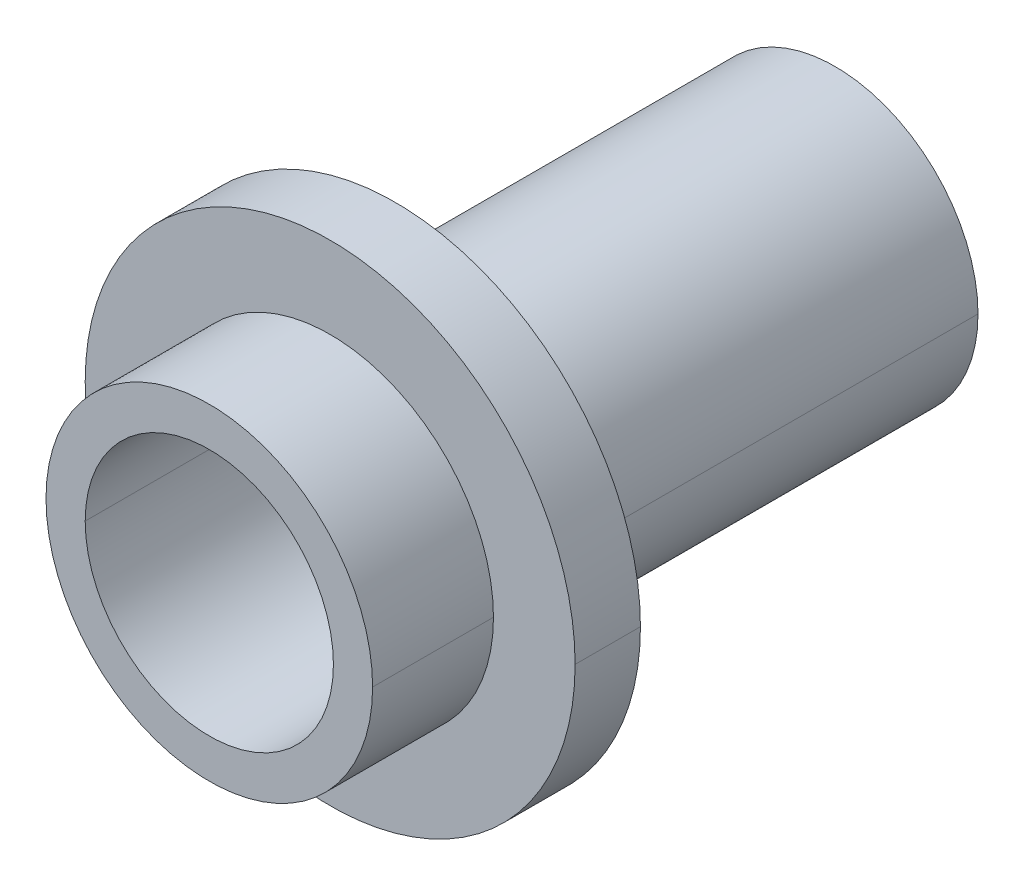
ISO-10303-21;
HEADER;
FILE_DESCRIPTION(('STEP AP214'),'2;1');
FILE_NAME('part.step','',(''),(''),'','','');
FILE_SCHEMA(('AUTOMOTIVE_DESIGN { 1 0 10303 214 1 1 1 1 }'));
ENDSEC;
DATA;
#1=APPLICATION_CONTEXT('core data for automotive mechanical design processes');
#2=APPLICATION_PROTOCOL_DEFINITION('international standard','automotive_design',2000,#1);
#3=PRODUCT_CONTEXT('',#1,'mechanical');
#4=PRODUCT('Part','Part','',(#3));
#5=PRODUCT_RELATED_PRODUCT_CATEGORY('part','',(#4));
#6=PRODUCT_DEFINITION_FORMATION('','',#4);
#7=PRODUCT_DEFINITION_CONTEXT('part definition',#1,'design');
#8=PRODUCT_DEFINITION('design','',#6,#7);
#9=PRODUCT_DEFINITION_SHAPE('','',#8);
#10=(LENGTH_UNIT() NAMED_UNIT(*) SI_UNIT(.MILLI.,.METRE.));
#11=(NAMED_UNIT(*) PLANE_ANGLE_UNIT() SI_UNIT($,.RADIAN.));
#12=(NAMED_UNIT(*) SI_UNIT($,.STERADIAN.) SOLID_ANGLE_UNIT());
#13=UNCERTAINTY_MEASURE_WITH_UNIT(LENGTH_MEASURE(1.E-05),#10,'distance_accuracy_value','');
#14=(GEOMETRIC_REPRESENTATION_CONTEXT(3) GLOBAL_UNCERTAINTY_ASSIGNED_CONTEXT((#13)) GLOBAL_UNIT_ASSIGNED_CONTEXT((#10,
#11,#12)) REPRESENTATION_CONTEXT('',''));
#15=CARTESIAN_POINT('',(0.,0.,0.));
#16=DIRECTION('',(0.,0.,1.));
#17=DIRECTION('',(1.,0.,0.));
#18=AXIS2_PLACEMENT_3D('',#15,#16,#17);
#19=CARTESIAN_POINT('',(0.,0.,-18.3642));
#20=DIRECTION('',(0.,0.,1.));
#21=DIRECTION('',(1.,0.,0.));
#22=AXIS2_PLACEMENT_3D('',#19,#20,#21);
#23=CYLINDRICAL_SURFACE('',#22,5.55625);
#24=DIRECTION('',(0.,0.,1.));
#25=VECTOR('',#24,1.);
#26=CARTESIAN_POINT('',(-5.55625,0.,-18.3642));
#27=LINE('',#26,#25);
#28=CARTESIAN_POINT('',(-5.55625,0.,-18.3642));
#29=VERTEX_POINT('',#28);
#30=CARTESIAN_POINT('',(-5.55625,0.,-1.27));
#31=VERTEX_POINT('',#30);
#32=EDGE_CURVE('E136',#29,#31,#27,.T.);
#33=ORIENTED_EDGE('',*,*,#32,.F.);
#34=CARTESIAN_POINT('',(0.,0.,-18.3642));
#35=DIRECTION('',(0.,0.,-1.));
#36=DIRECTION('',(-1.,0.,0.));
#37=AXIS2_PLACEMENT_3D('',#34,#35,#36);
#38=CIRCLE('',#37,5.55625);
#39=CARTESIAN_POINT('',(5.55625,0.,-18.3642));
#40=VERTEX_POINT('',#39);
#41=EDGE_CURVE('E11',#40,#29,#38,.T.);
#42=ORIENTED_EDGE('',*,*,#41,.F.);
#43=DIRECTION('',(0.,0.,1.));
#44=VECTOR('',#43,1.);
#45=CARTESIAN_POINT('',(5.55625,0.,-18.3642));
#46=LINE('',#45,#44);
#47=CARTESIAN_POINT('',(5.55625,0.,-1.27));
#48=VERTEX_POINT('',#47);
#49=EDGE_CURVE('E169',#40,#48,#46,.T.);
#50=ORIENTED_EDGE('',*,*,#49,.T.);
#51=CARTESIAN_POINT('',(0.,0.,-1.27));
#52=DIRECTION('',(0.,0.,-1.));
#53=DIRECTION('',(1.,0.,0.));
#54=AXIS2_PLACEMENT_3D('',#51,#52,#53);
#55=CIRCLE('',#54,5.55625);
#56=EDGE_CURVE('E111',#48,#31,#55,.T.);
#57=ORIENTED_EDGE('',*,*,#56,.T.);
#58=EDGE_LOOP('',(#33,#42,#50,#57));
#59=FACE_BOUND('',#58,.T.);
#60=ADVANCED_FACE('F16',(#59),#23,.T.);
#61=CARTESIAN_POINT('',(0.,0.,-18.3642));
#62=DIRECTION('',(0.,0.,-1.));
#63=DIRECTION('',(0.,-1.,0.));
#64=AXIS2_PLACEMENT_3D('',#61,#62,#63);
#65=PLANE('',#64);
#66=CARTESIAN_POINT('',(0.,0.,-18.3642));
#67=DIRECTION('',(0.,0.,-1.));
#68=DIRECTION('',(-1.,0.,0.));
#69=AXIS2_PLACEMENT_3D('',#66,#67,#68);
#70=CIRCLE('',#69,4.826);
#71=CARTESIAN_POINT('',(-4.826,0.,-18.3642));
#72=VERTEX_POINT('',#71);
#73=CARTESIAN_POINT('',(4.826,0.,-18.3642));
#74=VERTEX_POINT('',#73);
#75=EDGE_CURVE('E20',#72,#74,#70,.T.);
#76=ORIENTED_EDGE('',*,*,#75,.F.);
#77=CARTESIAN_POINT('',(0.,0.,-18.3642));
#78=DIRECTION('',(0.,0.,-1.));
#79=DIRECTION('',(-1.,0.,0.));
#80=AXIS2_PLACEMENT_3D('',#77,#78,#79);
#81=CIRCLE('',#80,4.826);
#82=EDGE_CURVE('E130',#74,#72,#81,.T.);
#83=ORIENTED_EDGE('',*,*,#82,.F.);
#84=EDGE_LOOP('',(#76,#83));
#85=FACE_BOUND('',#84,.T.);
#86=ORIENTED_EDGE('',*,*,#41,.T.);
#87=CARTESIAN_POINT('',(0.,0.,-18.3642));
#88=DIRECTION('',(0.,0.,-1.));
#89=DIRECTION('',(-1.,0.,0.));
#90=AXIS2_PLACEMENT_3D('',#87,#88,#89);
#91=CIRCLE('',#90,5.55625);
#92=EDGE_CURVE('E139',#29,#40,#91,.T.);
#93=ORIENTED_EDGE('',*,*,#92,.T.);
#94=EDGE_LOOP('',(#86,#93));
#95=FACE_BOUND('',#94,.T.);
#96=ADVANCED_FACE('F309',(#85,#95),#65,.T.);
#97=CARTESIAN_POINT('',(0.,0.,5.969));
#98=DIRECTION('',(0.,0.,-1.));
#99=DIRECTION('',(-1.,0.,0.));
#100=AXIS2_PLACEMENT_3D('',#97,#98,#99);
#101=CYLINDRICAL_SURFACE('',#100,6.35);
#102=DIRECTION('',(0.,0.,-1.));
#103=VECTOR('',#102,1.);
#104=CARTESIAN_POINT('',(6.35,0.,5.969));
#105=LINE('',#104,#103);
#106=CARTESIAN_POINT('',(6.35,0.,5.969));
#107=VERTEX_POINT('',#106);
#108=CARTESIAN_POINT('',(6.35,0.,1.27));
#109=VERTEX_POINT('',#108);
#110=EDGE_CURVE('E151',#107,#109,#105,.T.);
#111=ORIENTED_EDGE('',*,*,#110,.F.);
#112=CARTESIAN_POINT('',(0.,0.,5.969));
#113=DIRECTION('',(0.,0.,1.));
#114=DIRECTION('',(1.,0.,0.));
#115=AXIS2_PLACEMENT_3D('',#112,#113,#114);
#116=CIRCLE('',#115,6.35);
#117=CARTESIAN_POINT('',(-6.35,0.,5.969));
#118=VERTEX_POINT('',#117);
#119=EDGE_CURVE('E27',#118,#107,#116,.T.);
#120=ORIENTED_EDGE('',*,*,#119,.F.);
#121=DIRECTION('',(0.,0.,-1.));
#122=VECTOR('',#121,1.);
#123=CARTESIAN_POINT('',(-6.35,0.,5.969));
#124=LINE('',#123,#122);
#125=CARTESIAN_POINT('',(-6.35,0.,1.27));
#126=VERTEX_POINT('',#125);
#127=EDGE_CURVE('E150',#118,#126,#124,.T.);
#128=ORIENTED_EDGE('',*,*,#127,.T.);
#129=CARTESIAN_POINT('',(0.,0.,1.27));
#130=DIRECTION('',(0.,0.,1.));
#131=DIRECTION('',(1.,0.,0.));
#132=AXIS2_PLACEMENT_3D('',#129,#130,#131);
#133=CIRCLE('',#132,6.35);
#134=EDGE_CURVE('E110',#126,#109,#133,.T.);
#135=ORIENTED_EDGE('',*,*,#134,.T.);
#136=EDGE_LOOP('',(#111,#120,#128,#135));
#137=FACE_BOUND('',#136,.T.);
#138=ADVANCED_FACE('F305',(#137),#101,.T.);
#139=CARTESIAN_POINT('',(0.,0.,5.969));
#140=DIRECTION('',(0.,0.,1.));
#141=DIRECTION('',(1.,0.,0.));
#142=AXIS2_PLACEMENT_3D('',#139,#140,#141);
#143=PLANE('',#142);
#144=CARTESIAN_POINT('',(0.,0.,5.969));
#145=DIRECTION('',(0.,0.,1.));
#146=DIRECTION('',(1.,0.,0.));
#147=AXIS2_PLACEMENT_3D('',#144,#145,#146);
#148=CIRCLE('',#147,4.826);
#149=CARTESIAN_POINT('',(-4.826,0.,5.969));
#150=VERTEX_POINT('',#149);
#151=CARTESIAN_POINT('',(4.826,0.,5.969));
#152=VERTEX_POINT('',#151);
#153=EDGE_CURVE('E156',#150,#152,#148,.T.);
#154=ORIENTED_EDGE('',*,*,#153,.F.);
#155=CARTESIAN_POINT('',(0.,0.,5.969));
#156=DIRECTION('',(0.,0.,1.));
#157=DIRECTION('',(1.,0.,0.));
#158=AXIS2_PLACEMENT_3D('',#155,#156,#157);
#159=CIRCLE('',#158,4.826);
#160=EDGE_CURVE('E145',#152,#150,#159,.T.);
#161=ORIENTED_EDGE('',*,*,#160,.F.);
#162=EDGE_LOOP('',(#154,#161));
#163=FACE_BOUND('',#162,.T.);
#164=ORIENTED_EDGE('',*,*,#119,.T.);
#165=CARTESIAN_POINT('',(0.,0.,5.969));
#166=DIRECTION('',(0.,0.,1.));
#167=DIRECTION('',(1.,0.,0.));
#168=AXIS2_PLACEMENT_3D('',#165,#166,#167);
#169=CIRCLE('',#168,6.35);
#170=EDGE_CURVE('E134',#107,#118,#169,.T.);
#171=ORIENTED_EDGE('',*,*,#170,.T.);
#172=EDGE_LOOP('',(#164,#171));
#173=FACE_BOUND('',#172,.T.);
#174=ADVANCED_FACE('F281',(#163,#173),#143,.T.);
#175=CARTESIAN_POINT('',(0.,0.,1.27));
#176=DIRECTION('',(0.,0.,-1.));
#177=DIRECTION('',(-1.,0.,0.));
#178=AXIS2_PLACEMENT_3D('',#175,#176,#177);
#179=CYLINDRICAL_SURFACE('',#178,4.826);
#180=DIRECTION('',(0.,0.,-1.));
#181=VECTOR('',#180,1.);
#182=CARTESIAN_POINT('',(4.826,0.,1.27));
#183=LINE('',#182,#181);
#184=EDGE_CURVE('E152',#152,#74,#183,.T.);
#185=ORIENTED_EDGE('',*,*,#184,.F.);
#186=ORIENTED_EDGE('',*,*,#160,.T.);
#187=DIRECTION('',(0.,0.,-1.));
#188=VECTOR('',#187,1.);
#189=CARTESIAN_POINT('',(-4.826,0.,1.27));
#190=LINE('',#189,#188);
#191=EDGE_CURVE('E120',#150,#72,#190,.T.);
#192=ORIENTED_EDGE('',*,*,#191,.T.);
#193=ORIENTED_EDGE('',*,*,#75,.T.);
#194=EDGE_LOOP('',(#185,#186,#192,#193));
#195=FACE_BOUND('',#194,.T.);
#196=ADVANCED_FACE('F277',(#195),#179,.F.);
#197=CARTESIAN_POINT('',(0.,0.,1.27));
#198=DIRECTION('',(0.,0.,-1.));
#199=DIRECTION('',(-1.,0.,0.));
#200=AXIS2_PLACEMENT_3D('',#197,#198,#199);
#201=CYLINDRICAL_SURFACE('',#200,9.525);
#202=DIRECTION('',(0.,0.,-1.));
#203=VECTOR('',#202,1.);
#204=CARTESIAN_POINT('',(9.525,0.,1.27));
#205=LINE('',#204,#203);
#206=CARTESIAN_POINT('',(9.525,0.,1.27));
#207=VERTEX_POINT('',#206);
#208=CARTESIAN_POINT('',(9.525,0.,-1.27));
#209=VERTEX_POINT('',#208);
#210=EDGE_CURVE('E105',#207,#209,#205,.T.);
#211=ORIENTED_EDGE('',*,*,#210,.F.);
#212=CARTESIAN_POINT('',(0.,0.,1.27));
#213=DIRECTION('',(0.,0.,1.));
#214=DIRECTION('',(1.,0.,0.));
#215=AXIS2_PLACEMENT_3D('',#212,#213,#214);
#216=CIRCLE('',#215,9.525);
#217=CARTESIAN_POINT('',(-9.525,0.,1.27));
#218=VERTEX_POINT('',#217);
#219=EDGE_CURVE('E99',#218,#207,#216,.T.);
#220=ORIENTED_EDGE('',*,*,#219,.F.);
#221=DIRECTION('',(0.,0.,-1.));
#222=VECTOR('',#221,1.);
#223=CARTESIAN_POINT('',(-9.525,0.,1.27));
#224=LINE('',#223,#222);
#225=CARTESIAN_POINT('',(-9.525,0.,-1.27));
#226=VERTEX_POINT('',#225);
#227=EDGE_CURVE('E102',#218,#226,#224,.T.);
#228=ORIENTED_EDGE('',*,*,#227,.T.);
#229=CARTESIAN_POINT('',(0.,0.,-1.27));
#230=DIRECTION('',(0.,0.,1.));
#231=DIRECTION('',(1.,0.,0.));
#232=AXIS2_PLACEMENT_3D('',#229,#230,#231);
#233=CIRCLE('',#232,9.525);
#234=EDGE_CURVE('E40',#226,#209,#233,.T.);
#235=ORIENTED_EDGE('',*,*,#234,.T.);
#236=EDGE_LOOP('',(#211,#220,#228,#235));
#237=FACE_BOUND('',#236,.T.);
#238=ADVANCED_FACE('F101',(#237),#201,.T.);
#239=CARTESIAN_POINT('',(0.,0.,1.27));
#240=DIRECTION('',(0.,0.,1.));
#241=DIRECTION('',(1.,0.,0.));
#242=AXIS2_PLACEMENT_3D('',#239,#240,#241);
#243=PLANE('',#242);
#244=ORIENTED_EDGE('',*,*,#134,.F.);
#245=CARTESIAN_POINT('',(0.,0.,1.27));
#246=DIRECTION('',(0.,0.,1.));
#247=DIRECTION('',(1.,0.,0.));
#248=AXIS2_PLACEMENT_3D('',#245,#246,#247);
#249=CIRCLE('',#248,6.35);
#250=EDGE_CURVE('E146',#109,#126,#249,.T.);
#251=ORIENTED_EDGE('',*,*,#250,.F.);
#252=EDGE_LOOP('',(#244,#251));
#253=FACE_BOUND('',#252,.T.);
#254=ORIENTED_EDGE('',*,*,#219,.T.);
#255=CARTESIAN_POINT('',(0.,0.,1.27));
#256=DIRECTION('',(0.,0.,1.));
#257=DIRECTION('',(1.,0.,0.));
#258=AXIS2_PLACEMENT_3D('',#255,#256,#257);
#259=CIRCLE('',#258,9.525);
#260=EDGE_CURVE('E115',#207,#218,#259,.T.);
#261=ORIENTED_EDGE('',*,*,#260,.T.);
#262=EDGE_LOOP('',(#254,#261));
#263=FACE_BOUND('',#262,.T.);
#264=ADVANCED_FACE('F18',(#253,#263),#243,.T.);
#265=CARTESIAN_POINT('',(0.,0.,-1.27));
#266=DIRECTION('',(0.,0.,1.));
#267=DIRECTION('',(1.,0.,0.));
#268=AXIS2_PLACEMENT_3D('',#265,#266,#267);
#269=PLANE('',#268);
#270=ORIENTED_EDGE('',*,*,#56,.F.);
#271=CARTESIAN_POINT('',(0.,0.,-1.27));
#272=DIRECTION('',(0.,0.,-1.));
#273=DIRECTION('',(1.,0.,0.));
#274=AXIS2_PLACEMENT_3D('',#271,#272,#273);
#275=CIRCLE('',#274,5.55625);
#276=EDGE_CURVE('E138',#31,#48,#275,.T.);
#277=ORIENTED_EDGE('',*,*,#276,.F.);
#278=EDGE_LOOP('',(#270,#277));
#279=FACE_BOUND('',#278,.T.);
#280=ORIENTED_EDGE('',*,*,#234,.F.);
#281=CARTESIAN_POINT('',(0.,0.,-1.27));
#282=DIRECTION('',(0.,0.,1.));
#283=DIRECTION('',(1.,0.,0.));
#284=AXIS2_PLACEMENT_3D('',#281,#282,#283);
#285=CIRCLE('',#284,9.525);
#286=EDGE_CURVE('E116',#209,#226,#285,.T.);
#287=ORIENTED_EDGE('',*,*,#286,.F.);
#288=EDGE_LOOP('',(#280,#287));
#289=FACE_BOUND('',#288,.T.);
#290=ADVANCED_FACE('F287',(#279,#289),#269,.F.);
#291=CARTESIAN_POINT('',(0.,0.,1.27));
#292=DIRECTION('',(0.,0.,-1.));
#293=DIRECTION('',(-1.,0.,0.));
#294=AXIS2_PLACEMENT_3D('',#291,#292,#293);
#295=CYLINDRICAL_SURFACE('',#294,9.525);
#296=ORIENTED_EDGE('',*,*,#260,.F.);
#297=ORIENTED_EDGE('',*,*,#210,.T.);
#298=ORIENTED_EDGE('',*,*,#286,.T.);
#299=ORIENTED_EDGE('',*,*,#227,.F.);
#300=EDGE_LOOP('',(#296,#297,#298,#299));
#301=FACE_BOUND('',#300,.T.);
#302=ADVANCED_FACE('F114',(#301),#295,.T.);
#303=CARTESIAN_POINT('',(0.,0.,1.27));
#304=DIRECTION('',(0.,0.,-1.));
#305=DIRECTION('',(-1.,0.,0.));
#306=AXIS2_PLACEMENT_3D('',#303,#304,#305);
#307=CYLINDRICAL_SURFACE('',#306,4.826);
#308=ORIENTED_EDGE('',*,*,#153,.T.);
#309=ORIENTED_EDGE('',*,*,#184,.T.);
#310=ORIENTED_EDGE('',*,*,#82,.T.);
#311=ORIENTED_EDGE('',*,*,#191,.F.);
#312=EDGE_LOOP('',(#308,#309,#310,#311));
#313=FACE_BOUND('',#312,.T.);
#314=ADVANCED_FACE('F296',(#313),#307,.F.);
#315=CARTESIAN_POINT('',(0.,0.,5.969));
#316=DIRECTION('',(0.,0.,-1.));
#317=DIRECTION('',(-1.,0.,0.));
#318=AXIS2_PLACEMENT_3D('',#315,#316,#317);
#319=CYLINDRICAL_SURFACE('',#318,6.35);
#320=ORIENTED_EDGE('',*,*,#170,.F.);
#321=ORIENTED_EDGE('',*,*,#110,.T.);
#322=ORIENTED_EDGE('',*,*,#250,.T.);
#323=ORIENTED_EDGE('',*,*,#127,.F.);
#324=EDGE_LOOP('',(#320,#321,#322,#323));
#325=FACE_BOUND('',#324,.T.);
#326=ADVANCED_FACE('F272',(#325),#319,.T.);
#327=CARTESIAN_POINT('',(0.,0.,-18.3642));
#328=DIRECTION('',(0.,0.,1.));
#329=DIRECTION('',(1.,0.,0.));
#330=AXIS2_PLACEMENT_3D('',#327,#328,#329);
#331=CYLINDRICAL_SURFACE('',#330,5.55625);
#332=ORIENTED_EDGE('',*,*,#92,.F.);
#333=ORIENTED_EDGE('',*,*,#32,.T.);
#334=ORIENTED_EDGE('',*,*,#276,.T.);
#335=ORIENTED_EDGE('',*,*,#49,.F.);
#336=EDGE_LOOP('',(#332,#333,#334,#335));
#337=FACE_BOUND('',#336,.T.);
#338=ADVANCED_FACE('F268',(#337),#331,.T.);
#339=CLOSED_SHELL('',(#60,#96,#138,#174,#196,#238,#264,#290,#302,#314,#326,#338));
#340=MANIFOLD_SOLID_BREP('B1',#339);
#341=ADVANCED_BREP_SHAPE_REPRESENTATION('',(#18,#340),#14);
#342=SHAPE_DEFINITION_REPRESENTATION(#9,#341);
ENDSEC;
END-ISO-10303-21;
